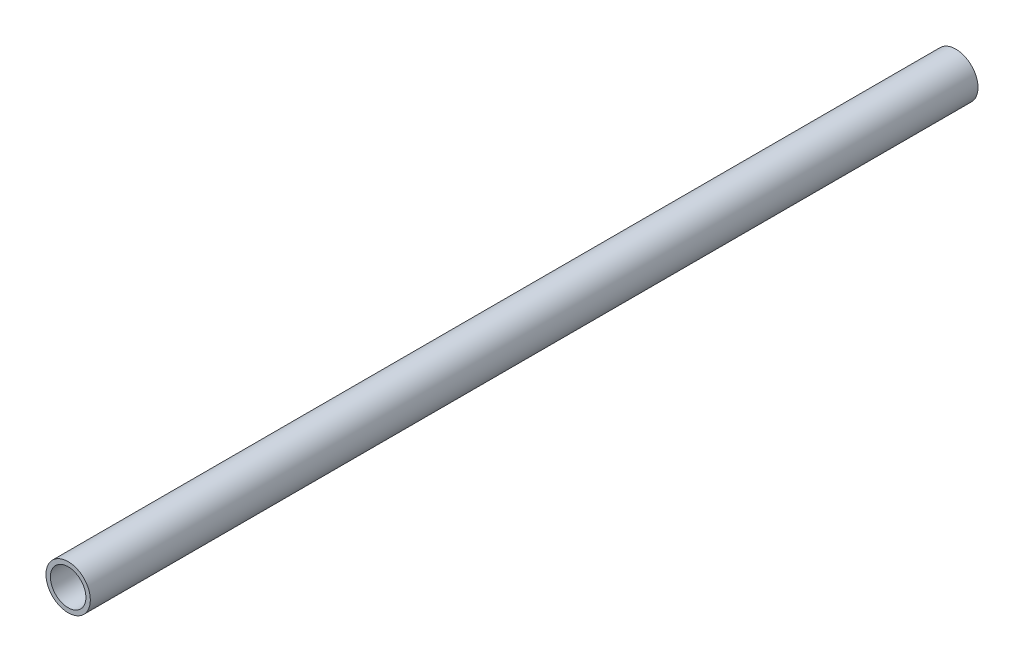
ISO-10303-21;
HEADER;
FILE_DESCRIPTION(('STEP AP214'),'2;1');
FILE_NAME('part.step','',(''),(''),'','','');
FILE_SCHEMA(('AUTOMOTIVE_DESIGN { 1 0 10303 214 1 1 1 1 }'));
ENDSEC;
DATA;
#1=APPLICATION_CONTEXT('core data for automotive mechanical design processes');
#2=APPLICATION_PROTOCOL_DEFINITION('international standard','automotive_design',2000,#1);
#3=PRODUCT_CONTEXT('',#1,'mechanical');
#4=PRODUCT('Part','Part','',(#3));
#5=PRODUCT_RELATED_PRODUCT_CATEGORY('part','',(#4));
#6=PRODUCT_DEFINITION_FORMATION('','',#4);
#7=PRODUCT_DEFINITION_CONTEXT('part definition',#1,'design');
#8=PRODUCT_DEFINITION('design','',#6,#7);
#9=PRODUCT_DEFINITION_SHAPE('','',#8);
#10=(LENGTH_UNIT() NAMED_UNIT(*) SI_UNIT(.MILLI.,.METRE.));
#11=(NAMED_UNIT(*) PLANE_ANGLE_UNIT() SI_UNIT($,.RADIAN.));
#12=(NAMED_UNIT(*) SI_UNIT($,.STERADIAN.) SOLID_ANGLE_UNIT());
#13=UNCERTAINTY_MEASURE_WITH_UNIT(LENGTH_MEASURE(1.E-05),#10,'distance_accuracy_value','');
#14=(GEOMETRIC_REPRESENTATION_CONTEXT(3) GLOBAL_UNCERTAINTY_ASSIGNED_CONTEXT((#13)) GLOBAL_UNIT_ASSIGNED_CONTEXT((#10,
#11,#12)) REPRESENTATION_CONTEXT('',''));
#15=CARTESIAN_POINT('',(0.,0.,0.));
#16=DIRECTION('',(0.,0.,1.));
#17=DIRECTION('',(1.,0.,0.));
#18=AXIS2_PLACEMENT_3D('',#15,#16,#17);
#19=CARTESIAN_POINT('',(0.,0.,400.));
#20=DIRECTION('',(0.,0.,1.));
#21=DIRECTION('',(1.,0.,0.));
#22=AXIS2_PLACEMENT_3D('',#19,#20,#21);
#23=PLANE('',#22);
#24=CARTESIAN_POINT('',(0.,0.,400.));
#25=DIRECTION('',(0.,0.,1.));
#26=DIRECTION('',(1.,0.,0.));
#27=AXIS2_PLACEMENT_3D('',#24,#25,#26);
#28=CIRCLE('',#27,10.);
#29=CARTESIAN_POINT('',(10.,0.,400.));
#30=VERTEX_POINT('',#29);
#31=EDGE_CURVE('E10',#30,#30,#28,.T.);
#32=ORIENTED_EDGE('',*,*,#31,.T.);
#33=EDGE_LOOP('',(#32));
#34=FACE_BOUND('',#33,.T.);
#35=CARTESIAN_POINT('',(0.,0.,400.));
#36=DIRECTION('',(0.,0.,1.));
#37=DIRECTION('',(1.,0.,0.));
#38=AXIS2_PLACEMENT_3D('',#35,#36,#37);
#39=CIRCLE('',#38,8.);
#40=CARTESIAN_POINT('',(8.,0.,400.));
#41=VERTEX_POINT('',#40);
#42=EDGE_CURVE('E42',#41,#41,#39,.T.);
#43=ORIENTED_EDGE('',*,*,#42,.F.);
#44=EDGE_LOOP('',(#43));
#45=FACE_BOUND('',#44,.T.);
#46=ADVANCED_FACE('F31',(#34,#45),#23,.T.);
#47=CARTESIAN_POINT('',(0.,0.,0.));
#48=DIRECTION('',(0.,0.,1.));
#49=DIRECTION('',(1.,0.,0.));
#50=AXIS2_PLACEMENT_3D('',#47,#48,#49);
#51=PLANE('',#50);
#52=CARTESIAN_POINT('',(0.,0.,0.));
#53=DIRECTION('',(0.,0.,1.));
#54=DIRECTION('',(1.,0.,0.));
#55=AXIS2_PLACEMENT_3D('',#52,#53,#54);
#56=CIRCLE('',#55,10.);
#57=CARTESIAN_POINT('',(10.,0.,0.));
#58=VERTEX_POINT('',#57);
#59=EDGE_CURVE('E35',#58,#58,#56,.T.);
#60=ORIENTED_EDGE('',*,*,#59,.F.);
#61=EDGE_LOOP('',(#60));
#62=FACE_BOUND('',#61,.T.);
#63=CARTESIAN_POINT('',(0.,0.,0.));
#64=DIRECTION('',(0.,0.,1.));
#65=DIRECTION('',(1.,0.,0.));
#66=AXIS2_PLACEMENT_3D('',#63,#64,#65);
#67=CIRCLE('',#66,8.);
#68=CARTESIAN_POINT('',(8.,0.,0.));
#69=VERTEX_POINT('',#68);
#70=EDGE_CURVE('E44',#69,#69,#67,.T.);
#71=ORIENTED_EDGE('',*,*,#70,.T.);
#72=EDGE_LOOP('',(#71));
#73=FACE_BOUND('',#72,.T.);
#74=ADVANCED_FACE('F54',(#62,#73),#51,.F.);
#75=CARTESIAN_POINT('',(0.,0.,400.));
#76=DIRECTION('',(0.,0.,-1.));
#77=DIRECTION('',(-1.,0.,0.));
#78=AXIS2_PLACEMENT_3D('',#75,#76,#77);
#79=CYLINDRICAL_SURFACE('',#78,10.);
#80=ORIENTED_EDGE('',*,*,#31,.F.);
#81=EDGE_LOOP('',(#80));
#82=FACE_BOUND('',#81,.T.);
#83=ORIENTED_EDGE('',*,*,#59,.T.);
#84=EDGE_LOOP('',(#83));
#85=FACE_BOUND('',#84,.T.);
#86=ADVANCED_FACE('F33',(#82,#85),#79,.T.);
#87=CARTESIAN_POINT('',(0.,0.,400.));
#88=DIRECTION('',(0.,0.,-1.));
#89=DIRECTION('',(-1.,0.,0.));
#90=AXIS2_PLACEMENT_3D('',#87,#88,#89);
#91=CYLINDRICAL_SURFACE('',#90,8.);
#92=ORIENTED_EDGE('',*,*,#42,.T.);
#93=EDGE_LOOP('',(#92));
#94=FACE_BOUND('',#93,.T.);
#95=ORIENTED_EDGE('',*,*,#70,.F.);
#96=EDGE_LOOP('',(#95));
#97=FACE_BOUND('',#96,.T.);
#98=ADVANCED_FACE('F50',(#94,#97),#91,.F.);
#99=CLOSED_SHELL('',(#46,#74,#86,#98));
#100=MANIFOLD_SOLID_BREP('B2',#99);
#101=ADVANCED_BREP_SHAPE_REPRESENTATION('',(#18,#100),#14);
#102=SHAPE_DEFINITION_REPRESENTATION(#9,#101);
ENDSEC;
END-ISO-10303-21;
